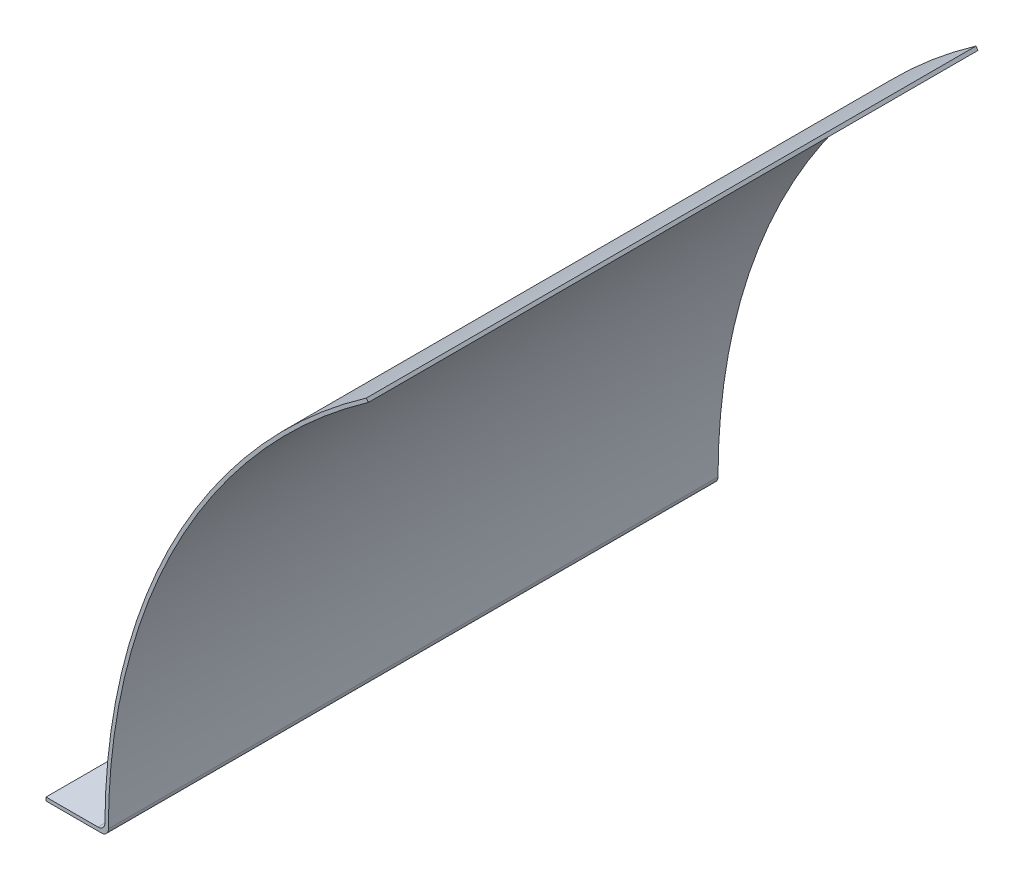
ISO-10303-21;
HEADER;
FILE_DESCRIPTION(('STEP AP214'),'2;1');
FILE_NAME('part.step','',(''),(''),'','','');
FILE_SCHEMA(('AUTOMOTIVE_DESIGN { 1 0 10303 214 1 1 1 1 }'));
ENDSEC;
DATA;
#1=APPLICATION_CONTEXT('core data for automotive mechanical design processes');
#2=APPLICATION_PROTOCOL_DEFINITION('international standard','automotive_design',2000,#1);
#3=PRODUCT_CONTEXT('',#1,'mechanical');
#4=PRODUCT('Part','Part','',(#3));
#5=PRODUCT_RELATED_PRODUCT_CATEGORY('part','',(#4));
#6=PRODUCT_DEFINITION_FORMATION('','',#4);
#7=PRODUCT_DEFINITION_CONTEXT('part definition',#1,'design');
#8=PRODUCT_DEFINITION('design','',#6,#7);
#9=PRODUCT_DEFINITION_SHAPE('','',#8);
#10=(LENGTH_UNIT() NAMED_UNIT(*) SI_UNIT(.MILLI.,.METRE.));
#11=(NAMED_UNIT(*) PLANE_ANGLE_UNIT() SI_UNIT($,.RADIAN.));
#12=(NAMED_UNIT(*) SI_UNIT($,.STERADIAN.) SOLID_ANGLE_UNIT());
#13=UNCERTAINTY_MEASURE_WITH_UNIT(LENGTH_MEASURE(1.E-05),#10,'distance_accuracy_value','');
#14=(GEOMETRIC_REPRESENTATION_CONTEXT(3) GLOBAL_UNCERTAINTY_ASSIGNED_CONTEXT((#13)) GLOBAL_UNIT_ASSIGNED_CONTEXT((#10,
#11,#12)) REPRESENTATION_CONTEXT('',''));
#15=CARTESIAN_POINT('',(0.,0.,0.));
#16=DIRECTION('',(0.,0.,1.));
#17=DIRECTION('',(1.,0.,0.));
#18=AXIS2_PLACEMENT_3D('',#15,#16,#17);
#19=CARTESIAN_POINT('',(0.,0.,279.4));
#20=DIRECTION('',(0.,0.,-1.));
#21=DIRECTION('',(-1.,0.,0.));
#22=AXIS2_PLACEMENT_3D('',#19,#20,#21);
#23=CYLINDRICAL_SURFACE('',#22,280.9875);
#24=CARTESIAN_POINT('',(0.,0.,0.));
#25=DIRECTION('',(0.,0.,1.));
#26=DIRECTION('',(-1.,0.,0.));
#27=AXIS2_PLACEMENT_3D('',#24,#25,#26);
#28=CIRCLE('',#27,280.9875);
#29=CARTESIAN_POINT('',(-161.167808909191,230.171485044652,0.));
#30=VERTEX_POINT('',#29);
#31=CARTESIAN_POINT('',(-280.983115154139,1.56976256983241,0.));
#32=VERTEX_POINT('',#31);
#33=EDGE_CURVE('E146',#30,#32,#28,.T.);
#34=ORIENTED_EDGE('',*,*,#33,.T.);
#35=DIRECTION('',(0.,0.,-1.));
#36=VECTOR('',#35,1.);
#37=CARTESIAN_POINT('',(-280.983115154139,1.56976256983241,279.4));
#38=LINE('',#37,#36);
#39=CARTESIAN_POINT('',(-280.983115154139,1.56976256983241,279.4));
#40=VERTEX_POINT('',#39);
#41=EDGE_CURVE('E11',#40,#32,#38,.T.);
#42=ORIENTED_EDGE('',*,*,#41,.F.);
#43=CARTESIAN_POINT('',(0.,0.,279.4));
#44=DIRECTION('',(0.,0.,1.));
#45=DIRECTION('',(-1.,0.,0.));
#46=AXIS2_PLACEMENT_3D('',#43,#44,#45);
#47=CIRCLE('',#46,280.9875);
#48=CARTESIAN_POINT('',(-161.167808909191,230.171485044652,279.4));
#49=VERTEX_POINT('',#48);
#50=EDGE_CURVE('E160',#49,#40,#47,.T.);
#51=ORIENTED_EDGE('',*,*,#50,.F.);
#52=DIRECTION('',(0.,0.,-1.));
#53=VECTOR('',#52,1.);
#54=CARTESIAN_POINT('',(-161.167808909191,230.171485044652,279.4));
#55=LINE('',#54,#53);
#56=EDGE_CURVE('E142',#49,#30,#55,.T.);
#57=ORIENTED_EDGE('',*,*,#56,.T.);
#58=EDGE_LOOP('',(#34,#42,#51,#57));
#59=FACE_BOUND('',#58,.T.);
#60=ADVANCED_FACE('F43',(#59),#23,.T.);
#61=CARTESIAN_POINT('',(-284.158065607858,1.58750000000002,279.4));
#62=DIRECTION('',(0.,0.,-1.));
#63=DIRECTION('',(-1.,0.,0.));
#64=AXIS2_PLACEMENT_3D('',#61,#62,#63);
#65=CYLINDRICAL_SURFACE('',#64,3.17500000000003);
#66=CARTESIAN_POINT('',(-284.158065607858,1.58750000000002,0.));
#67=DIRECTION('',(0.,0.,-1.));
#68=DIRECTION('',(-1.,0.,0.));
#69=AXIS2_PLACEMENT_3D('',#66,#67,#68);
#70=CIRCLE('',#69,3.17500000000003);
#71=CARTESIAN_POINT('',(-284.158065607858,-1.58749999999999,0.));
#72=VERTEX_POINT('',#71);
#73=EDGE_CURVE('E149',#32,#72,#70,.T.);
#74=ORIENTED_EDGE('',*,*,#73,.T.);
#75=DIRECTION('',(0.,0.,-1.));
#76=VECTOR('',#75,1.);
#77=CARTESIAN_POINT('',(-284.158065607858,-1.58749999999999,279.4));
#78=LINE('',#77,#76);
#79=CARTESIAN_POINT('',(-284.158065607858,-1.58749999999999,279.4));
#80=VERTEX_POINT('',#79);
#81=EDGE_CURVE('E52',#80,#72,#78,.T.);
#82=ORIENTED_EDGE('',*,*,#81,.F.);
#83=CARTESIAN_POINT('',(-284.158065607858,1.58750000000002,279.4));
#84=DIRECTION('',(0.,0.,-1.));
#85=DIRECTION('',(-1.,0.,0.));
#86=AXIS2_PLACEMENT_3D('',#83,#84,#85);
#87=CIRCLE('',#86,3.17500000000003);
#88=EDGE_CURVE('E105',#40,#80,#87,.T.);
#89=ORIENTED_EDGE('',*,*,#88,.F.);
#90=ORIENTED_EDGE('',*,*,#41,.T.);
#91=EDGE_LOOP('',(#74,#82,#89,#90));
#92=FACE_BOUND('',#91,.T.);
#93=ADVANCED_FACE('F202',(#92),#65,.F.);
#94=CARTESIAN_POINT('',(-284.158065607858,-1.58749999999999,279.4));
#95=DIRECTION('',(0.,-1.,0.));
#96=DIRECTION('',(1.,0.,0.));
#97=AXIS2_PLACEMENT_3D('',#94,#95,#96);
#98=PLANE('',#97);
#99=DIRECTION('',(-1.,0.,0.));
#100=VECTOR('',#99,1.);
#101=CARTESIAN_POINT('',(-284.158065607858,-1.58749999999999,0.));
#102=LINE('',#101,#100);
#103=CARTESIAN_POINT('',(-307.975,-1.5875,0.));
#104=VERTEX_POINT('',#103);
#105=EDGE_CURVE('E151',#72,#104,#102,.T.);
#106=ORIENTED_EDGE('',*,*,#105,.T.);
#107=DIRECTION('',(0.,0.,-1.));
#108=VECTOR('',#107,1.);
#109=CARTESIAN_POINT('',(-307.975,-1.5875,279.4));
#110=LINE('',#109,#108);
#111=CARTESIAN_POINT('',(-307.975,-1.5875,279.4));
#112=VERTEX_POINT('',#111);
#113=EDGE_CURVE('E171',#112,#104,#110,.T.);
#114=ORIENTED_EDGE('',*,*,#113,.F.);
#115=DIRECTION('',(-1.,0.,0.));
#116=VECTOR('',#115,1.);
#117=CARTESIAN_POINT('',(-284.158065607858,-1.58749999999999,279.4));
#118=LINE('',#117,#116);
#119=EDGE_CURVE('E181',#80,#112,#118,.T.);
#120=ORIENTED_EDGE('',*,*,#119,.F.);
#121=ORIENTED_EDGE('',*,*,#81,.T.);
#122=EDGE_LOOP('',(#106,#114,#120,#121));
#123=FACE_BOUND('',#122,.T.);
#124=ADVANCED_FACE('F179',(#123),#98,.F.);
#125=CARTESIAN_POINT('',(-307.975,-3.175,279.4));
#126=DIRECTION('',(1.,0.,0.));
#127=DIRECTION('',(0.,0.,-1.));
#128=AXIS2_PLACEMENT_3D('',#125,#126,#127);
#129=PLANE('',#128);
#130=DIRECTION('',(0.,-1.,0.));
#131=VECTOR('',#130,1.);
#132=CARTESIAN_POINT('',(-307.975,-3.175,0.));
#133=LINE('',#132,#131);
#134=CARTESIAN_POINT('',(-307.975,-3.175,0.));
#135=VERTEX_POINT('',#134);
#136=EDGE_CURVE('E153',#104,#135,#133,.T.);
#137=ORIENTED_EDGE('',*,*,#136,.T.);
#138=DIRECTION('',(0.,0.,-1.));
#139=VECTOR('',#138,1.);
#140=CARTESIAN_POINT('',(-307.975,-3.175,279.4));
#141=LINE('',#140,#139);
#142=CARTESIAN_POINT('',(-307.975,-3.175,279.4));
#143=VERTEX_POINT('',#142);
#144=EDGE_CURVE('E167',#143,#135,#141,.T.);
#145=ORIENTED_EDGE('',*,*,#144,.F.);
#146=DIRECTION('',(0.,-1.,0.));
#147=VECTOR('',#146,1.);
#148=CARTESIAN_POINT('',(-307.975,-3.175,279.4));
#149=LINE('',#148,#147);
#150=EDGE_CURVE('E193',#112,#143,#149,.T.);
#151=ORIENTED_EDGE('',*,*,#150,.F.);
#152=ORIENTED_EDGE('',*,*,#113,.T.);
#153=EDGE_LOOP('',(#137,#145,#151,#152));
#154=FACE_BOUND('',#153,.T.);
#155=ADVANCED_FACE('F189',(#154),#129,.F.);
#156=CARTESIAN_POINT('',(-282.575,-3.175,279.4));
#157=DIRECTION('',(0.,1.,0.));
#158=DIRECTION('',(-1.,0.,0.));
#159=AXIS2_PLACEMENT_3D('',#156,#157,#158);
#160=PLANE('',#159);
#161=DIRECTION('',(1.,0.,0.));
#162=VECTOR('',#161,1.);
#163=CARTESIAN_POINT('',(-282.575,-3.175,0.));
#164=LINE('',#163,#162);
#165=CARTESIAN_POINT('',(-282.575,-3.17500000000002,0.));
#166=VERTEX_POINT('',#165);
#167=EDGE_CURVE('E155',#135,#166,#164,.T.);
#168=ORIENTED_EDGE('',*,*,#167,.T.);
#169=DIRECTION('',(0.,0.,-1.));
#170=VECTOR('',#169,1.);
#171=CARTESIAN_POINT('',(-282.575,-3.17500000000002,279.4));
#172=LINE('',#171,#170);
#173=CARTESIAN_POINT('',(-282.575,-3.17500000000002,279.4));
#174=VERTEX_POINT('',#173);
#175=EDGE_CURVE('E135',#174,#166,#172,.T.);
#176=ORIENTED_EDGE('',*,*,#175,.F.);
#177=DIRECTION('',(1.,0.,0.));
#178=VECTOR('',#177,1.);
#179=CARTESIAN_POINT('',(-282.575,-3.175,279.4));
#180=LINE('',#179,#178);
#181=EDGE_CURVE('E124',#143,#174,#180,.T.);
#182=ORIENTED_EDGE('',*,*,#181,.F.);
#183=ORIENTED_EDGE('',*,*,#144,.T.);
#184=EDGE_LOOP('',(#168,#176,#182,#183));
#185=FACE_BOUND('',#184,.T.);
#186=ADVANCED_FACE('F192',(#185),#160,.F.);
#187=CARTESIAN_POINT('',(-282.575,0.,279.4));
#188=DIRECTION('',(0.,0.,-1.));
#189=DIRECTION('',(-1.,0.,0.));
#190=AXIS2_PLACEMENT_3D('',#187,#188,#189);
#191=CYLINDRICAL_SURFACE('',#190,3.17500000000002);
#192=CARTESIAN_POINT('',(-282.575,0.,0.));
#193=DIRECTION('',(0.,0.,1.));
#194=DIRECTION('',(-1.,0.,0.));
#195=AXIS2_PLACEMENT_3D('',#192,#193,#194);
#196=CIRCLE('',#195,3.17500000000002);
#197=CARTESIAN_POINT('',(-279.4,0.,0.));
#198=VERTEX_POINT('',#197);
#199=EDGE_CURVE('E133',#166,#198,#196,.T.);
#200=ORIENTED_EDGE('',*,*,#199,.T.);
#201=DIRECTION('',(0.,0.,-1.));
#202=VECTOR('',#201,1.);
#203=CARTESIAN_POINT('',(-279.4,0.,279.4));
#204=LINE('',#203,#202);
#205=CARTESIAN_POINT('',(-279.4,0.,279.4));
#206=VERTEX_POINT('',#205);
#207=EDGE_CURVE('E130',#206,#198,#204,.T.);
#208=ORIENTED_EDGE('',*,*,#207,.F.);
#209=CARTESIAN_POINT('',(-282.575,0.,279.4));
#210=DIRECTION('',(0.,0.,1.));
#211=DIRECTION('',(-1.,0.,0.));
#212=AXIS2_PLACEMENT_3D('',#209,#210,#211);
#213=CIRCLE('',#212,3.17500000000002);
#214=EDGE_CURVE('E118',#174,#206,#213,.T.);
#215=ORIENTED_EDGE('',*,*,#214,.F.);
#216=ORIENTED_EDGE('',*,*,#175,.T.);
#217=EDGE_LOOP('',(#200,#208,#215,#216));
#218=FACE_BOUND('',#217,.T.);
#219=ADVANCED_FACE('F131',(#218),#191,.T.);
#220=CARTESIAN_POINT('',(0.,0.,279.4));
#221=DIRECTION('',(0.,0.,-1.));
#222=DIRECTION('',(-1.,0.,0.));
#223=AXIS2_PLACEMENT_3D('',#220,#221,#222);
#224=CYLINDRICAL_SURFACE('',#223,279.4);
#225=CARTESIAN_POINT('',(0.,0.,0.));
#226=DIRECTION('',(0.,0.,-1.));
#227=DIRECTION('',(-1.,0.,0.));
#228=AXIS2_PLACEMENT_3D('',#225,#226,#227);
#229=CIRCLE('',#228,279.4);
#230=CARTESIAN_POINT('',(-160.257256316483,228.871081174344,0.));
#231=VERTEX_POINT('',#230);
#232=EDGE_CURVE('E89',#198,#231,#229,.T.);
#233=ORIENTED_EDGE('',*,*,#232,.T.);
#234=DIRECTION('',(0.,0.,-1.));
#235=VECTOR('',#234,1.);
#236=CARTESIAN_POINT('',(-160.257256316483,228.871081174344,279.4));
#237=LINE('',#236,#235);
#238=CARTESIAN_POINT('',(-160.257256316483,228.871081174344,279.4));
#239=VERTEX_POINT('',#238);
#240=EDGE_CURVE('E136',#239,#231,#237,.T.);
#241=ORIENTED_EDGE('',*,*,#240,.F.);
#242=CARTESIAN_POINT('',(0.,0.,279.4));
#243=DIRECTION('',(0.,0.,-1.));
#244=DIRECTION('',(-1.,0.,0.));
#245=AXIS2_PLACEMENT_3D('',#242,#243,#244);
#246=CIRCLE('',#245,279.4);
#247=EDGE_CURVE('E122',#206,#239,#246,.T.);
#248=ORIENTED_EDGE('',*,*,#247,.F.);
#249=ORIENTED_EDGE('',*,*,#207,.T.);
#250=EDGE_LOOP('',(#233,#241,#248,#249));
#251=FACE_BOUND('',#250,.T.);
#252=ADVANCED_FACE('F138',(#251),#224,.F.);
#253=CARTESIAN_POINT('',(-160.257256316483,228.871081174344,279.4));
#254=DIRECTION('',(-0.819152044288985,-0.573576436351056,0.));
#255=DIRECTION('',(0.573576436351056,-0.819152044288985,0.));
#256=AXIS2_PLACEMENT_3D('',#253,#254,#255);
#257=PLANE('',#256);
#258=DIRECTION('',(-0.573576436351056,0.819152044288985,0.));
#259=VECTOR('',#258,1.);
#260=CARTESIAN_POINT('',(-160.257256316483,228.871081174344,0.));
#261=LINE('',#260,#259);
#262=EDGE_CURVE('E95',#231,#30,#261,.T.);
#263=ORIENTED_EDGE('',*,*,#262,.T.);
#264=ORIENTED_EDGE('',*,*,#56,.F.);
#265=DIRECTION('',(-0.573576436351056,0.819152044288985,0.));
#266=VECTOR('',#265,1.);
#267=CARTESIAN_POINT('',(-160.257256316483,228.871081174344,279.4));
#268=LINE('',#267,#266);
#269=EDGE_CURVE('E60',#239,#49,#268,.T.);
#270=ORIENTED_EDGE('',*,*,#269,.F.);
#271=ORIENTED_EDGE('',*,*,#240,.T.);
#272=EDGE_LOOP('',(#263,#264,#270,#271));
#273=FACE_BOUND('',#272,.T.);
#274=ADVANCED_FACE('F218',(#273),#257,.F.);
#275=CARTESIAN_POINT('',(0.,0.,279.4));
#276=DIRECTION('',(0.,0.,-1.));
#277=DIRECTION('',(-1.,0.,0.));
#278=AXIS2_PLACEMENT_3D('',#275,#276,#277);
#279=PLANE('',#278);
#280=ORIENTED_EDGE('',*,*,#50,.T.);
#281=ORIENTED_EDGE('',*,*,#88,.T.);
#282=ORIENTED_EDGE('',*,*,#119,.T.);
#283=ORIENTED_EDGE('',*,*,#150,.T.);
#284=ORIENTED_EDGE('',*,*,#181,.T.);
#285=ORIENTED_EDGE('',*,*,#214,.T.);
#286=ORIENTED_EDGE('',*,*,#247,.T.);
#287=ORIENTED_EDGE('',*,*,#269,.T.);
#288=EDGE_LOOP('',(#280,#281,#282,#283,#284,#285,#286,#287));
#289=FACE_BOUND('',#288,.T.);
#290=ADVANCED_FACE('F120',(#289),#279,.F.);
#291=CARTESIAN_POINT('',(0.,0.,0.));
#292=DIRECTION('',(0.,0.,-1.));
#293=DIRECTION('',(-1.,0.,0.));
#294=AXIS2_PLACEMENT_3D('',#291,#292,#293);
#295=PLANE('',#294);
#296=ORIENTED_EDGE('',*,*,#33,.F.);
#297=ORIENTED_EDGE('',*,*,#262,.F.);
#298=ORIENTED_EDGE('',*,*,#232,.F.);
#299=ORIENTED_EDGE('',*,*,#199,.F.);
#300=ORIENTED_EDGE('',*,*,#167,.F.);
#301=ORIENTED_EDGE('',*,*,#136,.F.);
#302=ORIENTED_EDGE('',*,*,#105,.F.);
#303=ORIENTED_EDGE('',*,*,#73,.F.);
#304=EDGE_LOOP('',(#296,#297,#298,#299,#300,#301,#302,#303));
#305=FACE_BOUND('',#304,.T.);
#306=ADVANCED_FACE('F185',(#305),#295,.T.);
#307=CLOSED_SHELL('',(#60,#93,#124,#155,#186,#219,#252,#274,#290,#306));
#308=MANIFOLD_SOLID_BREP('B2',#307);
#309=ADVANCED_BREP_SHAPE_REPRESENTATION('',(#18,#308),#14);
#310=SHAPE_DEFINITION_REPRESENTATION(#9,#309);
ENDSEC;
END-ISO-10303-21;
